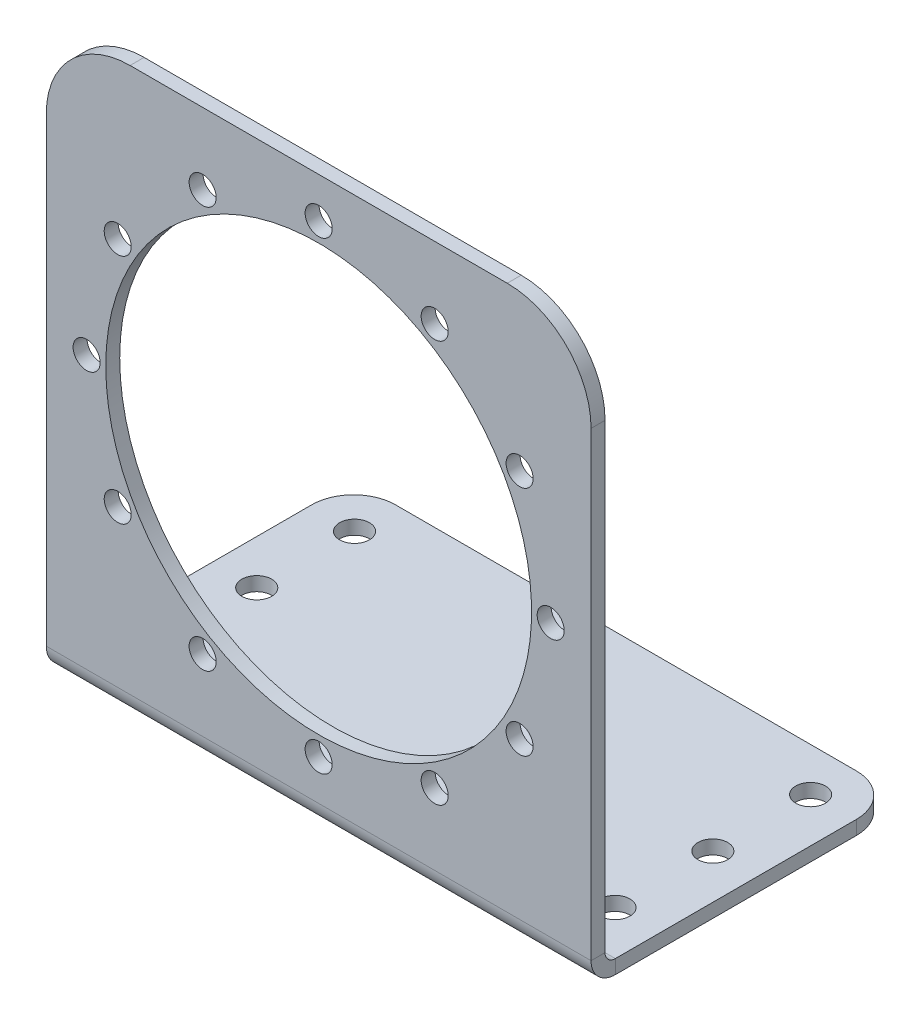
ISO-10303-21;
HEADER;
FILE_DESCRIPTION(('STEP AP214'),'2;1');
FILE_NAME('part.step','',(''),(''),'','','');
FILE_SCHEMA(('AUTOMOTIVE_DESIGN { 1 0 10303 214 1 1 1 1 }'));
ENDSEC;
DATA;
#1=APPLICATION_CONTEXT('core data for automotive mechanical design processes');
#2=APPLICATION_PROTOCOL_DEFINITION('international standard','automotive_design',2000,#1);
#3=PRODUCT_CONTEXT('',#1,'mechanical');
#4=PRODUCT('Part','Part','',(#3));
#5=PRODUCT_RELATED_PRODUCT_CATEGORY('part','',(#4));
#6=PRODUCT_DEFINITION_FORMATION('','',#4);
#7=PRODUCT_DEFINITION_CONTEXT('part definition',#1,'design');
#8=PRODUCT_DEFINITION('design','',#6,#7);
#9=PRODUCT_DEFINITION_SHAPE('','',#8);
#10=(LENGTH_UNIT() NAMED_UNIT(*) SI_UNIT(.MILLI.,.METRE.));
#11=(NAMED_UNIT(*) PLANE_ANGLE_UNIT() SI_UNIT($,.RADIAN.));
#12=(NAMED_UNIT(*) SI_UNIT($,.STERADIAN.) SOLID_ANGLE_UNIT());
#13=UNCERTAINTY_MEASURE_WITH_UNIT(LENGTH_MEASURE(1.E-05),#10,'distance_accuracy_value','');
#14=(GEOMETRIC_REPRESENTATION_CONTEXT(3) GLOBAL_UNCERTAINTY_ASSIGNED_CONTEXT((#13)) GLOBAL_UNIT_ASSIGNED_CONTEXT((#10,
#11,#12)) REPRESENTATION_CONTEXT('',''));
#15=CARTESIAN_POINT('',(0.,0.,0.));
#16=DIRECTION('',(0.,0.,1.));
#17=DIRECTION('',(1.,0.,0.));
#18=AXIS2_PLACEMENT_3D('',#15,#16,#17);
#19=CARTESIAN_POINT('',(0.,0.,-1.));
#20=DIRECTION('',(-1.,0.,0.));
#21=DIRECTION('',(0.,0.,1.));
#22=AXIS2_PLACEMENT_3D('',#19,#20,#21);
#23=PLANE('',#22);
#24=DIRECTION('',(0.,-1.,0.));
#25=VECTOR('',#24,1.);
#26=CARTESIAN_POINT('',(0.,0.,0.));
#27=LINE('',#26,#25);
#28=CARTESIAN_POINT('',(0.,33.,0.));
#29=VERTEX_POINT('',#28);
#30=CARTESIAN_POINT('',(0.,0.,0.));
#31=VERTEX_POINT('',#30);
#32=EDGE_CURVE('E197',#29,#31,#27,.T.);
#33=ORIENTED_EDGE('',*,*,#32,.F.);
#34=DIRECTION('',(0.,0.,1.));
#35=VECTOR('',#34,1.);
#36=CARTESIAN_POINT('',(0.,33.,-1.));
#37=LINE('',#36,#35);
#38=CARTESIAN_POINT('',(0.,33.,-1.));
#39=VERTEX_POINT('',#38);
#40=EDGE_CURVE('E235',#39,#29,#37,.T.);
#41=ORIENTED_EDGE('',*,*,#40,.F.);
#42=DIRECTION('',(0.,-1.,0.));
#43=VECTOR('',#42,1.);
#44=CARTESIAN_POINT('',(0.,0.,-1.));
#45=LINE('',#44,#43);
#46=CARTESIAN_POINT('',(0.,0.,-0.999999999999999));
#47=VERTEX_POINT('',#46);
#48=EDGE_CURVE('E202',#39,#47,#45,.T.);
#49=ORIENTED_EDGE('',*,*,#48,.T.);
#50=DIRECTION('',(0.,0.,1.));
#51=VECTOR('',#50,1.);
#52=CARTESIAN_POINT('',(0.,0.,-1.));
#53=LINE('',#52,#51);
#54=EDGE_CURVE('E220',#47,#31,#53,.T.);
#55=ORIENTED_EDGE('',*,*,#54,.T.);
#56=EDGE_LOOP('',(#33,#41,#49,#55));
#57=FACE_BOUND('',#56,.T.);
#58=ADVANCED_FACE('F60',(#57),#23,.T.);
#59=CARTESIAN_POINT('',(6.,33.,-1.));
#60=DIRECTION('',(0.,0.,1.));
#61=DIRECTION('',(1.,0.,0.));
#62=AXIS2_PLACEMENT_3D('',#59,#60,#61);
#63=CYLINDRICAL_SURFACE('',#62,6.);
#64=CARTESIAN_POINT('',(6.,33.,0.));
#65=DIRECTION('',(0.,0.,1.));
#66=DIRECTION('',(1.,0.,0.));
#67=AXIS2_PLACEMENT_3D('',#64,#65,#66);
#68=CIRCLE('',#67,6.);
#69=CARTESIAN_POINT('',(6.00000000000004,39.,0.));
#70=VERTEX_POINT('',#69);
#71=EDGE_CURVE('E206',#70,#29,#68,.T.);
#72=ORIENTED_EDGE('',*,*,#71,.F.);
#73=DIRECTION('',(0.,0.,1.));
#74=VECTOR('',#73,1.);
#75=CARTESIAN_POINT('',(6.00000000000004,39.,-1.));
#76=LINE('',#75,#74);
#77=CARTESIAN_POINT('',(6.00000000000004,39.,-1.));
#78=VERTEX_POINT('',#77);
#79=EDGE_CURVE('E238',#78,#70,#76,.T.);
#80=ORIENTED_EDGE('',*,*,#79,.F.);
#81=CARTESIAN_POINT('',(6.,33.,-1.));
#82=DIRECTION('',(0.,0.,1.));
#83=DIRECTION('',(1.,0.,0.));
#84=AXIS2_PLACEMENT_3D('',#81,#82,#83);
#85=CIRCLE('',#84,6.);
#86=EDGE_CURVE('E217',#78,#39,#85,.T.);
#87=ORIENTED_EDGE('',*,*,#86,.T.);
#88=ORIENTED_EDGE('',*,*,#40,.T.);
#89=EDGE_LOOP('',(#72,#80,#87,#88));
#90=FACE_BOUND('',#89,.T.);
#91=ADVANCED_FACE('F301',(#90),#63,.T.);
#92=CARTESIAN_POINT('',(6.00000000000004,39.,-1.));
#93=DIRECTION('',(0.,1.,0.));
#94=DIRECTION('',(0.,0.,1.));
#95=AXIS2_PLACEMENT_3D('',#92,#93,#94);
#96=PLANE('',#95);
#97=DIRECTION('',(-1.,0.,0.));
#98=VECTOR('',#97,1.);
#99=CARTESIAN_POINT('',(6.00000000000004,39.,0.));
#100=LINE('',#99,#98);
#101=CARTESIAN_POINT('',(33.,39.,0.));
#102=VERTEX_POINT('',#101);
#103=EDGE_CURVE('E230',#102,#70,#100,.T.);
#104=ORIENTED_EDGE('',*,*,#103,.F.);
#105=DIRECTION('',(0.,0.,1.));
#106=VECTOR('',#105,1.);
#107=CARTESIAN_POINT('',(33.,39.,-1.));
#108=LINE('',#107,#106);
#109=CARTESIAN_POINT('',(33.,39.,-1.));
#110=VERTEX_POINT('',#109);
#111=EDGE_CURVE('E240',#110,#102,#108,.T.);
#112=ORIENTED_EDGE('',*,*,#111,.F.);
#113=DIRECTION('',(-1.,0.,0.));
#114=VECTOR('',#113,1.);
#115=CARTESIAN_POINT('',(6.00000000000004,39.,-1.));
#116=LINE('',#115,#114);
#117=EDGE_CURVE('E214',#110,#78,#116,.T.);
#118=ORIENTED_EDGE('',*,*,#117,.T.);
#119=ORIENTED_EDGE('',*,*,#79,.T.);
#120=EDGE_LOOP('',(#104,#112,#118,#119));
#121=FACE_BOUND('',#120,.T.);
#122=ADVANCED_FACE('F303',(#121),#96,.T.);
#123=CARTESIAN_POINT('',(33.,33.,-1.));
#124=DIRECTION('',(0.,0.,1.));
#125=DIRECTION('',(1.,0.,0.));
#126=AXIS2_PLACEMENT_3D('',#123,#124,#125);
#127=CYLINDRICAL_SURFACE('',#126,6.);
#128=CARTESIAN_POINT('',(33.,33.,0.));
#129=DIRECTION('',(0.,0.,1.));
#130=DIRECTION('',(1.,0.,0.));
#131=AXIS2_PLACEMENT_3D('',#128,#129,#130);
#132=CIRCLE('',#131,6.);
#133=CARTESIAN_POINT('',(39.,33.,0.));
#134=VERTEX_POINT('',#133);
#135=EDGE_CURVE('E227',#134,#102,#132,.T.);
#136=ORIENTED_EDGE('',*,*,#135,.F.);
#137=DIRECTION('',(0.,0.,1.));
#138=VECTOR('',#137,1.);
#139=CARTESIAN_POINT('',(39.,33.,-1.));
#140=LINE('',#139,#138);
#141=CARTESIAN_POINT('',(39.,33.,-1.));
#142=VERTEX_POINT('',#141);
#143=EDGE_CURVE('E242',#142,#134,#140,.T.);
#144=ORIENTED_EDGE('',*,*,#143,.F.);
#145=CARTESIAN_POINT('',(33.,33.,-1.));
#146=DIRECTION('',(0.,0.,1.));
#147=DIRECTION('',(1.,0.,0.));
#148=AXIS2_PLACEMENT_3D('',#145,#146,#147);
#149=CIRCLE('',#148,6.);
#150=EDGE_CURVE('E211',#142,#110,#149,.T.);
#151=ORIENTED_EDGE('',*,*,#150,.T.);
#152=ORIENTED_EDGE('',*,*,#111,.T.);
#153=EDGE_LOOP('',(#136,#144,#151,#152));
#154=FACE_BOUND('',#153,.T.);
#155=ADVANCED_FACE('F293',(#154),#127,.T.);
#156=CARTESIAN_POINT('',(39.,0.,-1.));
#157=DIRECTION('',(1.,0.,0.));
#158=DIRECTION('',(0.,0.,-1.));
#159=AXIS2_PLACEMENT_3D('',#156,#157,#158);
#160=PLANE('',#159);
#161=DIRECTION('',(0.,1.,0.));
#162=VECTOR('',#161,1.);
#163=CARTESIAN_POINT('',(39.,0.,0.));
#164=LINE('',#163,#162);
#165=CARTESIAN_POINT('',(39.,0.,0.));
#166=VERTEX_POINT('',#165);
#167=EDGE_CURVE('E224',#166,#134,#164,.T.);
#168=ORIENTED_EDGE('',*,*,#167,.F.);
#169=DIRECTION('',(0.,0.,1.));
#170=VECTOR('',#169,1.);
#171=CARTESIAN_POINT('',(39.,0.,-1.));
#172=LINE('',#171,#170);
#173=CARTESIAN_POINT('',(39.,0.,-0.999999999999999));
#174=VERTEX_POINT('',#173);
#175=EDGE_CURVE('E244',#174,#166,#172,.T.);
#176=ORIENTED_EDGE('',*,*,#175,.F.);
#177=DIRECTION('',(0.,1.,0.));
#178=VECTOR('',#177,1.);
#179=CARTESIAN_POINT('',(39.,0.,-1.));
#180=LINE('',#179,#178);
#181=EDGE_CURVE('E208',#174,#142,#180,.T.);
#182=ORIENTED_EDGE('',*,*,#181,.T.);
#183=ORIENTED_EDGE('',*,*,#143,.T.);
#184=EDGE_LOOP('',(#168,#176,#182,#183));
#185=FACE_BOUND('',#184,.T.);
#186=ADVANCED_FACE('F284',(#185),#160,.T.);
#187=CARTESIAN_POINT('',(6.,33.,-1.));
#188=DIRECTION('',(0.,0.,1.));
#189=DIRECTION('',(1.,0.,0.));
#190=AXIS2_PLACEMENT_3D('',#187,#188,#189);
#191=PLANE('',#190);
#192=CARTESIAN_POINT('',(11.1947855554262,33.8850533857574,-1.));
#193=DIRECTION('',(0.,0.,-1.));
#194=DIRECTION('',(-1.,0.,0.));
#195=AXIS2_PLACEMENT_3D('',#192,#193,#194);
#196=CIRCLE('',#195,0.968487672521125);
#197=CARTESIAN_POINT('',(10.226297882905,33.8850533857574,-1.));
#198=VERTEX_POINT('',#197);
#199=EDGE_CURVE('E448',#198,#198,#196,.T.);
#200=ORIENTED_EDGE('',*,*,#199,.F.);
#201=EDGE_LOOP('',(#200));
#202=FACE_BOUND('',#201,.T.);
#203=CARTESIAN_POINT('',(5.11494661424296,27.8052144445739,-1.));
#204=DIRECTION('',(0.,0.,-1.));
#205=DIRECTION('',(-1.,0.,0.));
#206=AXIS2_PLACEMENT_3D('',#203,#204,#205);
#207=CIRCLE('',#206,0.968487672520813);
#208=CARTESIAN_POINT('',(4.14645894172215,27.8052144445739,-1.));
#209=VERTEX_POINT('',#208);
#210=EDGE_CURVE('E444',#209,#209,#207,.T.);
#211=ORIENTED_EDGE('',*,*,#210,.F.);
#212=EDGE_LOOP('',(#211));
#213=FACE_BOUND('',#212,.T.);
#214=CARTESIAN_POINT('',(2.88957111085208,19.5,-1.));
#215=DIRECTION('',(0.,0.,-1.));
#216=DIRECTION('',(-1.,0.,0.));
#217=AXIS2_PLACEMENT_3D('',#214,#215,#216);
#218=CIRCLE('',#217,0.968487672520642);
#219=CARTESIAN_POINT('',(1.92108343833144,19.5,-1.));
#220=VERTEX_POINT('',#219);
#221=EDGE_CURVE('E440',#220,#220,#218,.T.);
#222=ORIENTED_EDGE('',*,*,#221,.F.);
#223=EDGE_LOOP('',(#222));
#224=FACE_BOUND('',#223,.T.);
#225=CARTESIAN_POINT('',(5.11494661424299,11.194785555426,-1.));
#226=DIRECTION('',(0.,0.,-1.));
#227=DIRECTION('',(-1.,0.,0.));
#228=AXIS2_PLACEMENT_3D('',#225,#226,#227);
#229=CIRCLE('',#228,0.968487672520409);
#230=CARTESIAN_POINT('',(4.14645894172258,11.194785555426,-1.));
#231=VERTEX_POINT('',#230);
#232=EDGE_CURVE('E436',#231,#231,#229,.T.);
#233=ORIENTED_EDGE('',*,*,#232,.F.);
#234=EDGE_LOOP('',(#233));
#235=FACE_BOUND('',#234,.T.);
#236=CARTESIAN_POINT('',(11.1947855554261,5.11494661424296,-1.));
#237=DIRECTION('',(0.,0.,-1.));
#238=DIRECTION('',(-1.,0.,0.));
#239=AXIS2_PLACEMENT_3D('',#236,#237,#238);
#240=CIRCLE('',#239,0.968487672520217);
#241=CARTESIAN_POINT('',(10.2262978829058,5.11494661424296,-1.));
#242=VERTEX_POINT('',#241);
#243=EDGE_CURVE('E432',#242,#242,#240,.T.);
#244=ORIENTED_EDGE('',*,*,#243,.F.);
#245=EDGE_LOOP('',(#244));
#246=FACE_BOUND('',#245,.T.);
#247=CARTESIAN_POINT('',(19.5,2.88957111085208,-1.));
#248=DIRECTION('',(0.,0.,-1.));
#249=DIRECTION('',(-1.,0.,0.));
#250=AXIS2_PLACEMENT_3D('',#247,#248,#249);
#251=CIRCLE('',#250,0.968487672520107);
#252=CARTESIAN_POINT('',(18.5315123274799,2.88957111085208,-1.));
#253=VERTEX_POINT('',#252);
#254=EDGE_CURVE('E428',#253,#253,#251,.T.);
#255=ORIENTED_EDGE('',*,*,#254,.F.);
#256=EDGE_LOOP('',(#255));
#257=FACE_BOUND('',#256,.T.);
#258=CARTESIAN_POINT('',(27.805214444574,5.11494661424297,-1.));
#259=DIRECTION('',(0.,0.,-1.));
#260=DIRECTION('',(-1.,0.,0.));
#261=AXIS2_PLACEMENT_3D('',#258,#259,#260);
#262=CIRCLE('',#261,0.968487672520122);
#263=CARTESIAN_POINT('',(26.8367267720538,5.11494661424297,-1.));
#264=VERTEX_POINT('',#263);
#265=EDGE_CURVE('E424',#264,#264,#262,.T.);
#266=ORIENTED_EDGE('',*,*,#265,.F.);
#267=EDGE_LOOP('',(#266));
#268=FACE_BOUND('',#267,.T.);
#269=CARTESIAN_POINT('',(33.885053385757,11.194785555426,-1.));
#270=DIRECTION('',(0.,0.,-1.));
#271=DIRECTION('',(-1.,0.,0.));
#272=AXIS2_PLACEMENT_3D('',#269,#270,#271);
#273=CIRCLE('',#272,0.968487672520261);
#274=CARTESIAN_POINT('',(32.9165657132368,11.194785555426,-1.));
#275=VERTEX_POINT('',#274);
#276=EDGE_CURVE('E420',#275,#275,#273,.T.);
#277=ORIENTED_EDGE('',*,*,#276,.F.);
#278=EDGE_LOOP('',(#277));
#279=FACE_BOUND('',#278,.T.);
#280=CARTESIAN_POINT('',(36.1104288891479,19.5,-1.));
#281=DIRECTION('',(0.,0.,-1.));
#282=DIRECTION('',(-1.,0.,0.));
#283=AXIS2_PLACEMENT_3D('',#280,#281,#282);
#284=CIRCLE('',#283,0.968487672520483);
#285=CARTESIAN_POINT('',(35.1419412166274,19.5,-1.));
#286=VERTEX_POINT('',#285);
#287=EDGE_CURVE('E416',#286,#286,#284,.T.);
#288=ORIENTED_EDGE('',*,*,#287,.F.);
#289=EDGE_LOOP('',(#288));
#290=FACE_BOUND('',#289,.T.);
#291=CARTESIAN_POINT('',(33.885053385757,27.805214444574,-1.));
#292=DIRECTION('',(0.,0.,-1.));
#293=DIRECTION('',(-1.,0.,0.));
#294=AXIS2_PLACEMENT_3D('',#291,#292,#293);
#295=CIRCLE('',#294,0.968487672520739);
#296=CARTESIAN_POINT('',(32.9165657132363,27.805214444574,-1.));
#297=VERTEX_POINT('',#296);
#298=EDGE_CURVE('E412',#297,#297,#295,.T.);
#299=ORIENTED_EDGE('',*,*,#298,.F.);
#300=EDGE_LOOP('',(#299));
#301=FACE_BOUND('',#300,.T.);
#302=CARTESIAN_POINT('',(27.8052144445739,33.8850533857568,-1.));
#303=DIRECTION('',(0.,0.,-1.));
#304=DIRECTION('',(-1.,0.,0.));
#305=AXIS2_PLACEMENT_3D('',#302,#303,#304);
#306=CIRCLE('',#305,0.968487672521131);
#307=CARTESIAN_POINT('',(26.8367267720528,33.8850533857568,-1.));
#308=VERTEX_POINT('',#307);
#309=EDGE_CURVE('E408',#308,#308,#306,.T.);
#310=ORIENTED_EDGE('',*,*,#309,.F.);
#311=EDGE_LOOP('',(#310));
#312=FACE_BOUND('',#311,.T.);
#313=CARTESIAN_POINT('',(19.5,36.1104288891479,-1.));
#314=DIRECTION('',(0.,0.,-1.));
#315=DIRECTION('',(-1.,0.,0.));
#316=AXIS2_PLACEMENT_3D('',#313,#314,#315);
#317=CIRCLE('',#316,0.968487672521123);
#318=CARTESIAN_POINT('',(18.5315123274789,36.1104288891479,-1.));
#319=VERTEX_POINT('',#318);
#320=EDGE_CURVE('E404',#319,#319,#317,.T.);
#321=ORIENTED_EDGE('',*,*,#320,.F.);
#322=EDGE_LOOP('',(#321));
#323=FACE_BOUND('',#322,.T.);
#324=CARTESIAN_POINT('',(19.5,19.5,-1.));
#325=DIRECTION('',(0.,0.,-1.));
#326=DIRECTION('',(-1.,0.,0.));
#327=AXIS2_PLACEMENT_3D('',#324,#325,#326);
#328=CIRCLE('',#327,15.2419559251988);
#329=CARTESIAN_POINT('',(4.25804407480123,19.5,-1.));
#330=VERTEX_POINT('',#329);
#331=EDGE_CURVE('E399',#330,#330,#328,.T.);
#332=ORIENTED_EDGE('',*,*,#331,.F.);
#333=EDGE_LOOP('',(#332));
#334=FACE_BOUND('',#333,.T.);
#335=ORIENTED_EDGE('',*,*,#48,.F.);
#336=ORIENTED_EDGE('',*,*,#86,.F.);
#337=ORIENTED_EDGE('',*,*,#117,.F.);
#338=ORIENTED_EDGE('',*,*,#150,.F.);
#339=ORIENTED_EDGE('',*,*,#181,.F.);
#340=DIRECTION('',(1.,0.,0.));
#341=VECTOR('',#340,1.);
#342=CARTESIAN_POINT('',(0.,0.,-1.));
#343=LINE('',#342,#341);
#344=EDGE_CURVE('E205',#47,#174,#343,.T.);
#345=ORIENTED_EDGE('',*,*,#344,.F.);
#346=EDGE_LOOP('',(#335,#336,#337,#338,#339,#345));
#347=FACE_BOUND('',#346,.T.);
#348=ADVANCED_FACE('F288',(#202,#213,#224,#235,#246,#257,#268,#279,#290,#301,#312,#323,#334,
#347),#191,.F.);
#349=CARTESIAN_POINT('',(6.,33.,0.));
#350=DIRECTION('',(0.,0.,1.));
#351=DIRECTION('',(1.,0.,0.));
#352=AXIS2_PLACEMENT_3D('',#349,#350,#351);
#353=PLANE('',#352);
#354=CARTESIAN_POINT('',(11.1947855554262,33.8850533857574,0.));
#355=DIRECTION('',(0.,0.,-1.));
#356=DIRECTION('',(-1.,0.,0.));
#357=AXIS2_PLACEMENT_3D('',#354,#355,#356);
#358=CIRCLE('',#357,0.968487672521125);
#359=CARTESIAN_POINT('',(10.226297882905,33.8850533857574,0.));
#360=VERTEX_POINT('',#359);
#361=EDGE_CURVE('E351',#360,#360,#358,.T.);
#362=ORIENTED_EDGE('',*,*,#361,.T.);
#363=EDGE_LOOP('',(#362));
#364=FACE_BOUND('',#363,.T.);
#365=CARTESIAN_POINT('',(5.11494661424296,27.8052144445739,0.));
#366=DIRECTION('',(0.,0.,-1.));
#367=DIRECTION('',(-1.,0.,0.));
#368=AXIS2_PLACEMENT_3D('',#365,#366,#367);
#369=CIRCLE('',#368,0.968487672520813);
#370=CARTESIAN_POINT('',(4.14645894172215,27.8052144445739,0.));
#371=VERTEX_POINT('',#370);
#372=EDGE_CURVE('E355',#371,#371,#369,.T.);
#373=ORIENTED_EDGE('',*,*,#372,.T.);
#374=EDGE_LOOP('',(#373));
#375=FACE_BOUND('',#374,.T.);
#376=CARTESIAN_POINT('',(2.88957111085208,19.5,0.));
#377=DIRECTION('',(0.,0.,-1.));
#378=DIRECTION('',(-1.,0.,0.));
#379=AXIS2_PLACEMENT_3D('',#376,#377,#378);
#380=CIRCLE('',#379,0.968487672520642);
#381=CARTESIAN_POINT('',(1.92108343833144,19.5,0.));
#382=VERTEX_POINT('',#381);
#383=EDGE_CURVE('E359',#382,#382,#380,.T.);
#384=ORIENTED_EDGE('',*,*,#383,.T.);
#385=EDGE_LOOP('',(#384));
#386=FACE_BOUND('',#385,.T.);
#387=CARTESIAN_POINT('',(5.11494661424299,11.194785555426,0.));
#388=DIRECTION('',(0.,0.,-1.));
#389=DIRECTION('',(-1.,0.,0.));
#390=AXIS2_PLACEMENT_3D('',#387,#388,#389);
#391=CIRCLE('',#390,0.968487672520409);
#392=CARTESIAN_POINT('',(4.14645894172258,11.194785555426,0.));
#393=VERTEX_POINT('',#392);
#394=EDGE_CURVE('E363',#393,#393,#391,.T.);
#395=ORIENTED_EDGE('',*,*,#394,.T.);
#396=EDGE_LOOP('',(#395));
#397=FACE_BOUND('',#396,.T.);
#398=CARTESIAN_POINT('',(11.1947855554261,5.11494661424296,0.));
#399=DIRECTION('',(0.,0.,-1.));
#400=DIRECTION('',(-1.,0.,0.));
#401=AXIS2_PLACEMENT_3D('',#398,#399,#400);
#402=CIRCLE('',#401,0.968487672520217);
#403=CARTESIAN_POINT('',(10.2262978829058,5.11494661424296,0.));
#404=VERTEX_POINT('',#403);
#405=EDGE_CURVE('E367',#404,#404,#402,.T.);
#406=ORIENTED_EDGE('',*,*,#405,.T.);
#407=EDGE_LOOP('',(#406));
#408=FACE_BOUND('',#407,.T.);
#409=CARTESIAN_POINT('',(19.5,2.88957111085208,0.));
#410=DIRECTION('',(0.,0.,-1.));
#411=DIRECTION('',(-1.,0.,0.));
#412=AXIS2_PLACEMENT_3D('',#409,#410,#411);
#413=CIRCLE('',#412,0.968487672520107);
#414=CARTESIAN_POINT('',(18.5315123274799,2.88957111085208,0.));
#415=VERTEX_POINT('',#414);
#416=EDGE_CURVE('E371',#415,#415,#413,.T.);
#417=ORIENTED_EDGE('',*,*,#416,.T.);
#418=EDGE_LOOP('',(#417));
#419=FACE_BOUND('',#418,.T.);
#420=CARTESIAN_POINT('',(27.805214444574,5.11494661424297,0.));
#421=DIRECTION('',(0.,0.,-1.));
#422=DIRECTION('',(-1.,0.,0.));
#423=AXIS2_PLACEMENT_3D('',#420,#421,#422);
#424=CIRCLE('',#423,0.968487672520122);
#425=CARTESIAN_POINT('',(26.8367267720538,5.11494661424297,0.));
#426=VERTEX_POINT('',#425);
#427=EDGE_CURVE('E375',#426,#426,#424,.T.);
#428=ORIENTED_EDGE('',*,*,#427,.T.);
#429=EDGE_LOOP('',(#428));
#430=FACE_BOUND('',#429,.T.);
#431=CARTESIAN_POINT('',(33.885053385757,11.194785555426,0.));
#432=DIRECTION('',(0.,0.,-1.));
#433=DIRECTION('',(-1.,0.,0.));
#434=AXIS2_PLACEMENT_3D('',#431,#432,#433);
#435=CIRCLE('',#434,0.968487672520261);
#436=CARTESIAN_POINT('',(32.9165657132368,11.194785555426,0.));
#437=VERTEX_POINT('',#436);
#438=EDGE_CURVE('E379',#437,#437,#435,.T.);
#439=ORIENTED_EDGE('',*,*,#438,.T.);
#440=EDGE_LOOP('',(#439));
#441=FACE_BOUND('',#440,.T.);
#442=CARTESIAN_POINT('',(36.1104288891479,19.5,0.));
#443=DIRECTION('',(0.,0.,-1.));
#444=DIRECTION('',(-1.,0.,0.));
#445=AXIS2_PLACEMENT_3D('',#442,#443,#444);
#446=CIRCLE('',#445,0.968487672520483);
#447=CARTESIAN_POINT('',(35.1419412166274,19.5,0.));
#448=VERTEX_POINT('',#447);
#449=EDGE_CURVE('E383',#448,#448,#446,.T.);
#450=ORIENTED_EDGE('',*,*,#449,.T.);
#451=EDGE_LOOP('',(#450));
#452=FACE_BOUND('',#451,.T.);
#453=CARTESIAN_POINT('',(33.885053385757,27.805214444574,0.));
#454=DIRECTION('',(0.,0.,-1.));
#455=DIRECTION('',(-1.,0.,0.));
#456=AXIS2_PLACEMENT_3D('',#453,#454,#455);
#457=CIRCLE('',#456,0.968487672520739);
#458=CARTESIAN_POINT('',(32.9165657132363,27.805214444574,0.));
#459=VERTEX_POINT('',#458);
#460=EDGE_CURVE('E387',#459,#459,#457,.T.);
#461=ORIENTED_EDGE('',*,*,#460,.T.);
#462=EDGE_LOOP('',(#461));
#463=FACE_BOUND('',#462,.T.);
#464=CARTESIAN_POINT('',(27.8052144445739,33.8850533857568,0.));
#465=DIRECTION('',(0.,0.,-1.));
#466=DIRECTION('',(-1.,0.,0.));
#467=AXIS2_PLACEMENT_3D('',#464,#465,#466);
#468=CIRCLE('',#467,0.968487672521131);
#469=CARTESIAN_POINT('',(26.8367267720528,33.8850533857568,0.));
#470=VERTEX_POINT('',#469);
#471=EDGE_CURVE('E391',#470,#470,#468,.T.);
#472=ORIENTED_EDGE('',*,*,#471,.T.);
#473=EDGE_LOOP('',(#472));
#474=FACE_BOUND('',#473,.T.);
#475=CARTESIAN_POINT('',(19.5,36.1104288891479,0.));
#476=DIRECTION('',(0.,0.,-1.));
#477=DIRECTION('',(-1.,0.,0.));
#478=AXIS2_PLACEMENT_3D('',#475,#476,#477);
#479=CIRCLE('',#478,0.968487672521123);
#480=CARTESIAN_POINT('',(18.5315123274789,36.1104288891479,0.));
#481=VERTEX_POINT('',#480);
#482=EDGE_CURVE('E395',#481,#481,#479,.T.);
#483=ORIENTED_EDGE('',*,*,#482,.T.);
#484=EDGE_LOOP('',(#483));
#485=FACE_BOUND('',#484,.T.);
#486=CARTESIAN_POINT('',(19.5,19.5,0.));
#487=DIRECTION('',(0.,0.,-1.));
#488=DIRECTION('',(-1.,0.,0.));
#489=AXIS2_PLACEMENT_3D('',#486,#487,#488);
#490=CIRCLE('',#489,15.2419559251988);
#491=CARTESIAN_POINT('',(4.25804407480123,19.5,0.));
#492=VERTEX_POINT('',#491);
#493=EDGE_CURVE('E196',#492,#492,#490,.T.);
#494=ORIENTED_EDGE('',*,*,#493,.T.);
#495=EDGE_LOOP('',(#494));
#496=FACE_BOUND('',#495,.T.);
#497=ORIENTED_EDGE('',*,*,#32,.T.);
#498=DIRECTION('',(1.,0.,0.));
#499=VECTOR('',#498,1.);
#500=CARTESIAN_POINT('',(0.,0.,0.));
#501=LINE('',#500,#499);
#502=EDGE_CURVE('E158',#31,#166,#501,.T.);
#503=ORIENTED_EDGE('',*,*,#502,.T.);
#504=ORIENTED_EDGE('',*,*,#167,.T.);
#505=ORIENTED_EDGE('',*,*,#135,.T.);
#506=ORIENTED_EDGE('',*,*,#103,.T.);
#507=ORIENTED_EDGE('',*,*,#71,.T.);
#508=EDGE_LOOP('',(#497,#503,#504,#505,#506,#507));
#509=FACE_BOUND('',#508,.T.);
#510=ADVANCED_FACE('F296',(#364,#375,#386,#397,#408,#419,#430,#441,#452,#463,#474,#485,#496,
#509),#353,.T.);
#511=CARTESIAN_POINT('',(39.,0.,-1.7366));
#512=DIRECTION('',(1.,0.,0.));
#513=DIRECTION('',(0.,1.,0.));
#514=AXIS2_PLACEMENT_3D('',#511,#512,#513);
#515=PLANE('',#514);
#516=DIRECTION('',(0.,1.,0.));
#517=VECTOR('',#516,1.);
#518=CARTESIAN_POINT('',(39.,-1.7366,-1.73659999999999));
#519=LINE('',#518,#517);
#520=CARTESIAN_POINT('',(39.,-0.7366,-1.7366));
#521=VERTEX_POINT('',#520);
#522=CARTESIAN_POINT('',(39.,-1.7366,-1.73659999999999));
#523=VERTEX_POINT('',#522);
#524=EDGE_CURVE('E193',#521,#523,#519,.F.);
#525=ORIENTED_EDGE('',*,*,#524,.F.);
#526=CARTESIAN_POINT('',(39.,0.,-1.7366));
#527=DIRECTION('',(-1.,0.,0.));
#528=DIRECTION('',(0.,-1.,0.));
#529=AXIS2_PLACEMENT_3D('',#526,#527,#528);
#530=CIRCLE('',#529,0.736600000000001);
#531=EDGE_CURVE('E162',#174,#521,#530,.F.);
#532=ORIENTED_EDGE('',*,*,#531,.F.);
#533=ORIENTED_EDGE('',*,*,#175,.T.);
#534=CARTESIAN_POINT('',(39.,0.,-1.7366));
#535=DIRECTION('',(-1.,0.,0.));
#536=DIRECTION('',(0.,-1.,0.));
#537=AXIS2_PLACEMENT_3D('',#534,#535,#536);
#538=CIRCLE('',#537,1.7366);
#539=EDGE_CURVE('E161',#166,#523,#538,.F.);
#540=ORIENTED_EDGE('',*,*,#539,.T.);
#541=EDGE_LOOP('',(#525,#532,#533,#540));
#542=FACE_BOUND('',#541,.T.);
#543=ADVANCED_FACE('F280',(#542),#515,.T.);
#544=CARTESIAN_POINT('',(0.,0.,-1.7366));
#545=DIRECTION('',(1.,0.,0.));
#546=DIRECTION('',(0.,1.,0.));
#547=AXIS2_PLACEMENT_3D('',#544,#545,#546);
#548=PLANE('',#547);
#549=CARTESIAN_POINT('',(0.,0.,-1.7366));
#550=DIRECTION('',(-1.,0.,0.));
#551=DIRECTION('',(0.,-1.,0.));
#552=AXIS2_PLACEMENT_3D('',#549,#550,#551);
#553=CIRCLE('',#552,0.736600000000001);
#554=CARTESIAN_POINT('',(0.,-0.736600000000003,-1.7366));
#555=VERTEX_POINT('',#554);
#556=EDGE_CURVE('E169',#555,#47,#553,.T.);
#557=ORIENTED_EDGE('',*,*,#556,.F.);
#558=DIRECTION('',(0.,1.,0.));
#559=VECTOR('',#558,1.);
#560=CARTESIAN_POINT('',(0.,-0.7366,-1.7366));
#561=LINE('',#560,#559);
#562=CARTESIAN_POINT('',(0.,-1.7366,-1.73659999999999));
#563=VERTEX_POINT('',#562);
#564=EDGE_CURVE('E166',#555,#563,#561,.F.);
#565=ORIENTED_EDGE('',*,*,#564,.T.);
#566=CARTESIAN_POINT('',(0.,0.,-1.7366));
#567=DIRECTION('',(-1.,0.,0.));
#568=DIRECTION('',(0.,-1.,0.));
#569=AXIS2_PLACEMENT_3D('',#566,#567,#568);
#570=CIRCLE('',#569,1.7366);
#571=EDGE_CURVE('E151',#563,#31,#570,.T.);
#572=ORIENTED_EDGE('',*,*,#571,.T.);
#573=ORIENTED_EDGE('',*,*,#54,.F.);
#574=EDGE_LOOP('',(#557,#565,#572,#573));
#575=FACE_BOUND('',#574,.T.);
#576=ADVANCED_FACE('F167',(#575),#548,.F.);
#577=CARTESIAN_POINT('',(0.,0.,-1.7366));
#578=DIRECTION('',(-1.,0.,0.));
#579=DIRECTION('',(0.,-1.,0.));
#580=AXIS2_PLACEMENT_3D('',#577,#578,#579);
#581=CYLINDRICAL_SURFACE('',#580,1.7366);
#582=ORIENTED_EDGE('',*,*,#502,.F.);
#583=ORIENTED_EDGE('',*,*,#571,.F.);
#584=DIRECTION('',(-1.,0.,0.));
#585=VECTOR('',#584,1.);
#586=CARTESIAN_POINT('',(39.,-1.7366,-1.73659999999999));
#587=LINE('',#586,#585);
#588=EDGE_CURVE('E155',#563,#523,#587,.F.);
#589=ORIENTED_EDGE('',*,*,#588,.T.);
#590=ORIENTED_EDGE('',*,*,#539,.F.);
#591=EDGE_LOOP('',(#582,#583,#589,#590));
#592=FACE_BOUND('',#591,.T.);
#593=ADVANCED_FACE('F153',(#592),#581,.T.);
#594=CARTESIAN_POINT('',(0.,0.,-1.7366));
#595=DIRECTION('',(-1.,0.,0.));
#596=DIRECTION('',(0.,-1.,0.));
#597=AXIS2_PLACEMENT_3D('',#594,#595,#596);
#598=CYLINDRICAL_SURFACE('',#597,0.736600000000001);
#599=ORIENTED_EDGE('',*,*,#344,.T.);
#600=ORIENTED_EDGE('',*,*,#531,.T.);
#601=DIRECTION('',(-1.,0.,0.));
#602=VECTOR('',#601,1.);
#603=CARTESIAN_POINT('',(39.,-0.7366,-1.7366));
#604=LINE('',#603,#602);
#605=EDGE_CURVE('E171',#521,#555,#604,.T.);
#606=ORIENTED_EDGE('',*,*,#605,.T.);
#607=ORIENTED_EDGE('',*,*,#556,.T.);
#608=EDGE_LOOP('',(#599,#600,#606,#607));
#609=FACE_BOUND('',#608,.T.);
#610=ADVANCED_FACE('F275',(#609),#598,.F.);
#611=CARTESIAN_POINT('',(0.,-1.73660000000007,-22.));
#612=DIRECTION('',(1.,0.,0.));
#613=DIRECTION('',(0.,0.,-1.));
#614=AXIS2_PLACEMENT_3D('',#611,#612,#613);
#615=PLANE('',#614);
#616=DIRECTION('',(0.,0.,1.));
#617=VECTOR('',#616,1.);
#618=CARTESIAN_POINT('',(0.,-0.736600000000071,-22.));
#619=LINE('',#618,#617);
#620=CARTESIAN_POINT('',(0.,-0.73660000000006,-19.));
#621=VERTEX_POINT('',#620);
#622=EDGE_CURVE('E179',#555,#621,#619,.F.);
#623=ORIENTED_EDGE('',*,*,#622,.T.);
#624=DIRECTION('',(0.,1.,0.));
#625=VECTOR('',#624,1.);
#626=CARTESIAN_POINT('',(0.,-1.73660000000006,-19.));
#627=LINE('',#626,#625);
#628=CARTESIAN_POINT('',(0.,-1.73660000000006,-19.));
#629=VERTEX_POINT('',#628);
#630=EDGE_CURVE('E13',#621,#629,#627,.F.);
#631=ORIENTED_EDGE('',*,*,#630,.T.);
#632=DIRECTION('',(0.,0.,-1.));
#633=VECTOR('',#632,1.);
#634=CARTESIAN_POINT('',(0.,-1.73659999999999,0.));
#635=LINE('',#634,#633);
#636=EDGE_CURVE('E175',#563,#629,#635,.T.);
#637=ORIENTED_EDGE('',*,*,#636,.F.);
#638=ORIENTED_EDGE('',*,*,#564,.F.);
#639=EDGE_LOOP('',(#623,#631,#637,#638));
#640=FACE_BOUND('',#639,.T.);
#641=ADVANCED_FACE('F181',(#640),#615,.F.);
#642=CARTESIAN_POINT('',(39.,-1.7366,-0.999999999999997));
#643=DIRECTION('',(-1.,0.,0.));
#644=DIRECTION('',(0.,0.,1.));
#645=AXIS2_PLACEMENT_3D('',#642,#643,#644);
#646=PLANE('',#645);
#647=DIRECTION('',(0.,0.,1.));
#648=VECTOR('',#647,1.);
#649=CARTESIAN_POINT('',(39.,-1.73659999999999,0.));
#650=LINE('',#649,#648);
#651=CARTESIAN_POINT('',(39.,-1.73660000000006,-19.));
#652=VERTEX_POINT('',#651);
#653=EDGE_CURVE('E178',#652,#523,#650,.T.);
#654=ORIENTED_EDGE('',*,*,#653,.F.);
#655=DIRECTION('',(0.,1.,0.));
#656=VECTOR('',#655,1.);
#657=CARTESIAN_POINT('',(39.,-1.73660000000006,-19.));
#658=LINE('',#657,#656);
#659=CARTESIAN_POINT('',(39.,-0.73660000000006,-19.));
#660=VERTEX_POINT('',#659);
#661=EDGE_CURVE('E237',#652,#660,#658,.T.);
#662=ORIENTED_EDGE('',*,*,#661,.T.);
#663=DIRECTION('',(0.,0.,-1.));
#664=VECTOR('',#663,1.);
#665=CARTESIAN_POINT('',(39.,-0.736599999999997,-1.));
#666=LINE('',#665,#664);
#667=EDGE_CURVE('E183',#660,#521,#666,.F.);
#668=ORIENTED_EDGE('',*,*,#667,.T.);
#669=ORIENTED_EDGE('',*,*,#524,.T.);
#670=EDGE_LOOP('',(#654,#662,#668,#669));
#671=FACE_BOUND('',#670,.T.);
#672=ADVANCED_FACE('F263',(#671),#646,.F.);
#673=CARTESIAN_POINT('',(0.,-1.73659999999999,0.));
#674=DIRECTION('',(0.,1.,0.));
#675=DIRECTION('',(0.,0.,1.));
#676=AXIS2_PLACEMENT_3D('',#673,#674,#675);
#677=PLANE('',#676);
#678=CARTESIAN_POINT('',(35.8245183934839,-1.73660000000006,-18.8915720295029));
#679=DIRECTION('',(0.,1.,0.));
#680=DIRECTION('',(0.,0.,-1.));
#681=AXIS2_PLACEMENT_3D('',#678,#679,#680);
#682=CIRCLE('',#681,1.06661142234424);
#683=CARTESIAN_POINT('',(35.8245183934839,-1.73660000000006,-19.9581834518471));
#684=VERTEX_POINT('',#683);
#685=EDGE_CURVE('E480',#684,#684,#682,.T.);
#686=ORIENTED_EDGE('',*,*,#685,.T.);
#687=EDGE_LOOP('',(#686));
#688=FACE_BOUND('',#687,.T.);
#689=CARTESIAN_POINT('',(35.8245183934838,-1.73660000000004,-11.8915720295029));
#690=DIRECTION('',(0.,1.,0.));
#691=DIRECTION('',(0.,0.,-1.));
#692=AXIS2_PLACEMENT_3D('',#689,#690,#691);
#693=CIRCLE('',#692,1.06661142234424);
#694=CARTESIAN_POINT('',(35.8245183934838,-1.73660000000004,-12.9581834518471));
#695=VERTEX_POINT('',#694);
#696=EDGE_CURVE('E474',#695,#695,#693,.T.);
#697=ORIENTED_EDGE('',*,*,#696,.T.);
#698=EDGE_LOOP('',(#697));
#699=FACE_BOUND('',#698,.T.);
#700=CARTESIAN_POINT('',(3.17548160651623,-1.73660000000001,-4.89157202950286));
#701=DIRECTION('',(0.,1.,0.));
#702=DIRECTION('',(0.,0.,1.));
#703=AXIS2_PLACEMENT_3D('',#700,#701,#702);
#704=CIRCLE('',#703,1.06661142234424);
#705=CARTESIAN_POINT('',(3.17548160651623,-1.73660000000001,-3.82496060715862));
#706=VERTEX_POINT('',#705);
#707=EDGE_CURVE('E468',#706,#706,#704,.T.);
#708=ORIENTED_EDGE('',*,*,#707,.T.);
#709=EDGE_LOOP('',(#708));
#710=FACE_BOUND('',#709,.T.);
#711=CARTESIAN_POINT('',(3.17548160651616,-1.73660000000004,-11.8915720295029));
#712=DIRECTION('',(0.,1.,0.));
#713=DIRECTION('',(0.,0.,1.));
#714=AXIS2_PLACEMENT_3D('',#711,#712,#713);
#715=CIRCLE('',#714,1.06661142234424);
#716=CARTESIAN_POINT('',(3.17548160651616,-1.73660000000003,-10.8249606071586));
#717=VERTEX_POINT('',#716);
#718=EDGE_CURVE('E462',#717,#717,#715,.T.);
#719=ORIENTED_EDGE('',*,*,#718,.T.);
#720=EDGE_LOOP('',(#719));
#721=FACE_BOUND('',#720,.T.);
#722=CARTESIAN_POINT('',(35.8245183934838,-1.73660000000001,-4.89157202950286));
#723=DIRECTION('',(0.,1.,0.));
#724=DIRECTION('',(0.,0.,-1.));
#725=AXIS2_PLACEMENT_3D('',#722,#723,#724);
#726=CIRCLE('',#725,1.06661142234424);
#727=CARTESIAN_POINT('',(35.8245183934838,-1.73660000000001,-5.9581834518471));
#728=VERTEX_POINT('',#727);
#729=EDGE_CURVE('E456',#728,#728,#726,.T.);
#730=ORIENTED_EDGE('',*,*,#729,.T.);
#731=EDGE_LOOP('',(#730));
#732=FACE_BOUND('',#731,.T.);
#733=CARTESIAN_POINT('',(3.17548160651609,-1.73660000000006,-18.8915720295029));
#734=DIRECTION('',(0.,1.,0.));
#735=DIRECTION('',(0.,0.,1.));
#736=AXIS2_PLACEMENT_3D('',#733,#734,#735);
#737=CIRCLE('',#736,1.06661142234424);
#738=CARTESIAN_POINT('',(3.17548160651609,-1.73660000000006,-17.8249606071586));
#739=VERTEX_POINT('',#738);
#740=EDGE_CURVE('E451',#739,#739,#737,.T.);
#741=ORIENTED_EDGE('',*,*,#740,.T.);
#742=EDGE_LOOP('',(#741));
#743=FACE_BOUND('',#742,.T.);
#744=DIRECTION('',(1.,0.,0.));
#745=VECTOR('',#744,1.);
#746=CARTESIAN_POINT('',(0.,-1.73660000000007,-22.));
#747=LINE('',#746,#745);
#748=CARTESIAN_POINT('',(3.,-1.73660000000007,-22.));
#749=VERTEX_POINT('',#748);
#750=CARTESIAN_POINT('',(36.,-1.73660000000007,-22.));
#751=VERTEX_POINT('',#750);
#752=EDGE_CURVE('E182',#749,#751,#747,.T.);
#753=ORIENTED_EDGE('',*,*,#752,.T.);
#754=CARTESIAN_POINT('',(36.,-1.73660000000006,-19.));
#755=DIRECTION('',(0.,1.,0.));
#756=DIRECTION('',(0.,0.,1.));
#757=AXIS2_PLACEMENT_3D('',#754,#755,#756);
#758=CIRCLE('',#757,3.);
#759=EDGE_CURVE('E68',#751,#652,#758,.F.);
#760=ORIENTED_EDGE('',*,*,#759,.T.);
#761=ORIENTED_EDGE('',*,*,#653,.T.);
#762=ORIENTED_EDGE('',*,*,#588,.F.);
#763=ORIENTED_EDGE('',*,*,#636,.T.);
#764=CARTESIAN_POINT('',(3.,-1.73660000000006,-19.));
#765=DIRECTION('',(0.,1.,0.));
#766=DIRECTION('',(0.,0.,1.));
#767=AXIS2_PLACEMENT_3D('',#764,#765,#766);
#768=CIRCLE('',#767,3.);
#769=EDGE_CURVE('E258',#629,#749,#768,.F.);
#770=ORIENTED_EDGE('',*,*,#769,.T.);
#771=EDGE_LOOP('',(#753,#760,#761,#762,#763,#770));
#772=FACE_BOUND('',#771,.T.);
#773=ADVANCED_FACE('F174',(#688,#699,#710,#721,#732,#743,#772),#677,.F.);
#774=CARTESIAN_POINT('',(0.,-0.736599999999994,0.));
#775=DIRECTION('',(0.,1.,0.));
#776=DIRECTION('',(0.,0.,1.));
#777=AXIS2_PLACEMENT_3D('',#774,#775,#776);
#778=PLANE('',#777);
#779=CARTESIAN_POINT('',(35.8245183934839,-0.73660000000006,-18.8915720295029));
#780=DIRECTION('',(0.,1.,0.));
#781=DIRECTION('',(0.,0.,-1.));
#782=AXIS2_PLACEMENT_3D('',#779,#780,#781);
#783=CIRCLE('',#782,1.06661142234424);
#784=CARTESIAN_POINT('',(35.8245183934839,-0.736600000000064,-19.9581834518471));
#785=VERTEX_POINT('',#784);
#786=EDGE_CURVE('E483',#785,#785,#783,.T.);
#787=ORIENTED_EDGE('',*,*,#786,.F.);
#788=EDGE_LOOP('',(#787));
#789=FACE_BOUND('',#788,.T.);
#790=CARTESIAN_POINT('',(35.8245183934838,-0.736600000000035,-11.8915720295029));
#791=DIRECTION('',(0.,1.,0.));
#792=DIRECTION('',(0.,0.,-1.));
#793=AXIS2_PLACEMENT_3D('',#790,#791,#792);
#794=CIRCLE('',#793,1.06661142234424);
#795=CARTESIAN_POINT('',(35.8245183934838,-0.736600000000039,-12.9581834518471));
#796=VERTEX_POINT('',#795);
#797=EDGE_CURVE('E477',#796,#796,#794,.T.);
#798=ORIENTED_EDGE('',*,*,#797,.F.);
#799=EDGE_LOOP('',(#798));
#800=FACE_BOUND('',#799,.T.);
#801=CARTESIAN_POINT('',(3.17548160651623,-0.736600000000011,-4.89157202950286));
#802=DIRECTION('',(0.,1.,0.));
#803=DIRECTION('',(0.,0.,1.));
#804=AXIS2_PLACEMENT_3D('',#801,#802,#803);
#805=CIRCLE('',#804,1.06661142234424);
#806=CARTESIAN_POINT('',(3.17548160651623,-0.736600000000007,-3.82496060715862));
#807=VERTEX_POINT('',#806);
#808=EDGE_CURVE('E471',#807,#807,#805,.T.);
#809=ORIENTED_EDGE('',*,*,#808,.F.);
#810=EDGE_LOOP('',(#809));
#811=FACE_BOUND('',#810,.T.);
#812=CARTESIAN_POINT('',(3.17548160651616,-0.736600000000035,-11.8915720295029));
#813=DIRECTION('',(0.,1.,0.));
#814=DIRECTION('',(0.,0.,1.));
#815=AXIS2_PLACEMENT_3D('',#812,#813,#814);
#816=CIRCLE('',#815,1.06661142234424);
#817=CARTESIAN_POINT('',(3.17548160651616,-0.736600000000032,-10.8249606071586));
#818=VERTEX_POINT('',#817);
#819=EDGE_CURVE('E465',#818,#818,#816,.T.);
#820=ORIENTED_EDGE('',*,*,#819,.F.);
#821=EDGE_LOOP('',(#820));
#822=FACE_BOUND('',#821,.T.);
#823=CARTESIAN_POINT('',(35.8245183934838,-0.736600000000011,-4.89157202950286));
#824=DIRECTION('',(0.,1.,0.));
#825=DIRECTION('',(0.,0.,-1.));
#826=AXIS2_PLACEMENT_3D('',#823,#824,#825);
#827=CIRCLE('',#826,1.06661142234424);
#828=CARTESIAN_POINT('',(35.8245183934838,-0.736600000000015,-5.9581834518471));
#829=VERTEX_POINT('',#828);
#830=EDGE_CURVE('E459',#829,#829,#827,.T.);
#831=ORIENTED_EDGE('',*,*,#830,.F.);
#832=EDGE_LOOP('',(#831));
#833=FACE_BOUND('',#832,.T.);
#834=CARTESIAN_POINT('',(3.17548160651609,-0.73660000000006,-18.8915720295029));
#835=DIRECTION('',(0.,1.,0.));
#836=DIRECTION('',(0.,0.,1.));
#837=AXIS2_PLACEMENT_3D('',#834,#835,#836);
#838=CIRCLE('',#837,1.06661142234424);
#839=CARTESIAN_POINT('',(3.17548160651609,-0.736600000000056,-17.8249606071586));
#840=VERTEX_POINT('',#839);
#841=EDGE_CURVE('E453',#840,#840,#838,.T.);
#842=ORIENTED_EDGE('',*,*,#841,.F.);
#843=EDGE_LOOP('',(#842));
#844=FACE_BOUND('',#843,.T.);
#845=ORIENTED_EDGE('',*,*,#667,.F.);
#846=CARTESIAN_POINT('',(36.,-0.73660000000006,-19.));
#847=DIRECTION('',(0.,1.,0.));
#848=DIRECTION('',(0.,0.,1.));
#849=AXIS2_PLACEMENT_3D('',#846,#847,#848);
#850=CIRCLE('',#849,3.);
#851=CARTESIAN_POINT('',(36.,-0.736600000000071,-22.));
#852=VERTEX_POINT('',#851);
#853=EDGE_CURVE('E252',#660,#852,#850,.T.);
#854=ORIENTED_EDGE('',*,*,#853,.T.);
#855=DIRECTION('',(-1.,0.,0.));
#856=VECTOR('',#855,1.);
#857=CARTESIAN_POINT('',(39.,-0.736600000000071,-22.));
#858=LINE('',#857,#856);
#859=CARTESIAN_POINT('',(3.,-0.736600000000071,-22.));
#860=VERTEX_POINT('',#859);
#861=EDGE_CURVE('E186',#860,#852,#858,.F.);
#862=ORIENTED_EDGE('',*,*,#861,.F.);
#863=CARTESIAN_POINT('',(3.,-0.73660000000006,-19.));
#864=DIRECTION('',(0.,1.,0.));
#865=DIRECTION('',(0.,0.,1.));
#866=AXIS2_PLACEMENT_3D('',#863,#864,#865);
#867=CIRCLE('',#866,3.);
#868=EDGE_CURVE('E250',#860,#621,#867,.T.);
#869=ORIENTED_EDGE('',*,*,#868,.T.);
#870=ORIENTED_EDGE('',*,*,#622,.F.);
#871=ORIENTED_EDGE('',*,*,#605,.F.);
#872=EDGE_LOOP('',(#845,#854,#862,#869,#870,#871));
#873=FACE_BOUND('',#872,.T.);
#874=ADVANCED_FACE('F269',(#789,#800,#811,#822,#833,#844,#873),#778,.T.);
#875=CARTESIAN_POINT('',(39.,-1.73660000000007,-22.));
#876=DIRECTION('',(0.,0.,1.));
#877=DIRECTION('',(0.,-1.,0.));
#878=AXIS2_PLACEMENT_3D('',#875,#876,#877);
#879=PLANE('',#878);
#880=ORIENTED_EDGE('',*,*,#861,.T.);
#881=DIRECTION('',(0.,1.,0.));
#882=VECTOR('',#881,1.);
#883=CARTESIAN_POINT('',(36.,-1.73660000000007,-22.));
#884=LINE('',#883,#882);
#885=EDGE_CURVE('E81',#852,#751,#884,.F.);
#886=ORIENTED_EDGE('',*,*,#885,.T.);
#887=ORIENTED_EDGE('',*,*,#752,.F.);
#888=DIRECTION('',(0.,1.,0.));
#889=VECTOR('',#888,1.);
#890=CARTESIAN_POINT('',(3.,-1.73660000000007,-22.));
#891=LINE('',#890,#889);
#892=EDGE_CURVE('E254',#749,#860,#891,.T.);
#893=ORIENTED_EDGE('',*,*,#892,.T.);
#894=EDGE_LOOP('',(#880,#886,#887,#893));
#895=FACE_BOUND('',#894,.T.);
#896=ADVANCED_FACE('F271',(#895),#879,.F.);
#897=CARTESIAN_POINT('',(36.,-1.73660000000006,-19.));
#898=DIRECTION('',(0.,1.,0.));
#899=DIRECTION('',(0.,0.,1.));
#900=AXIS2_PLACEMENT_3D('',#897,#898,#899);
#901=CYLINDRICAL_SURFACE('',#900,3.);
#902=ORIENTED_EDGE('',*,*,#759,.F.);
#903=ORIENTED_EDGE('',*,*,#885,.F.);
#904=ORIENTED_EDGE('',*,*,#853,.F.);
#905=ORIENTED_EDGE('',*,*,#661,.F.);
#906=EDGE_LOOP('',(#902,#903,#904,#905));
#907=FACE_BOUND('',#906,.T.);
#908=ADVANCED_FACE('F266',(#907),#901,.T.);
#909=CARTESIAN_POINT('',(3.,-1.73660000000006,-19.));
#910=DIRECTION('',(0.,1.,0.));
#911=DIRECTION('',(0.,0.,1.));
#912=AXIS2_PLACEMENT_3D('',#909,#910,#911);
#913=CYLINDRICAL_SURFACE('',#912,3.);
#914=ORIENTED_EDGE('',*,*,#769,.F.);
#915=ORIENTED_EDGE('',*,*,#630,.F.);
#916=ORIENTED_EDGE('',*,*,#868,.F.);
#917=ORIENTED_EDGE('',*,*,#892,.F.);
#918=EDGE_LOOP('',(#914,#915,#916,#917));
#919=FACE_BOUND('',#918,.T.);
#920=ADVANCED_FACE('F62',(#919),#913,.T.);
#921=CARTESIAN_POINT('',(19.5,19.5,0.));
#922=DIRECTION('',(0.,0.,-1.));
#923=DIRECTION('',(-1.,0.,0.));
#924=AXIS2_PLACEMENT_3D('',#921,#922,#923);
#925=CYLINDRICAL_SURFACE('',#924,15.2419559251988);
#926=ORIENTED_EDGE('',*,*,#493,.F.);
#927=EDGE_LOOP('',(#926));
#928=FACE_BOUND('',#927,.T.);
#929=ORIENTED_EDGE('',*,*,#331,.T.);
#930=EDGE_LOOP('',(#929));
#931=FACE_BOUND('',#930,.T.);
#932=ADVANCED_FACE('F322',(#928,#931),#925,.F.);
#933=CARTESIAN_POINT('',(19.5,36.1104288891479,0.));
#934=DIRECTION('',(0.,0.,-1.));
#935=DIRECTION('',(-1.,0.,0.));
#936=AXIS2_PLACEMENT_3D('',#933,#934,#935);
#937=CYLINDRICAL_SURFACE('',#936,0.968487672521123);
#938=ORIENTED_EDGE('',*,*,#482,.F.);
#939=EDGE_LOOP('',(#938));
#940=FACE_BOUND('',#939,.T.);
#941=ORIENTED_EDGE('',*,*,#320,.T.);
#942=EDGE_LOOP('',(#941));
#943=FACE_BOUND('',#942,.T.);
#944=ADVANCED_FACE('F565',(#940,#943),#937,.F.);
#945=CARTESIAN_POINT('',(27.8052144445739,33.8850533857568,0.));
#946=DIRECTION('',(0.,0.,-1.));
#947=DIRECTION('',(-1.,0.,0.));
#948=AXIS2_PLACEMENT_3D('',#945,#946,#947);
#949=CYLINDRICAL_SURFACE('',#948,0.968487672521131);
#950=ORIENTED_EDGE('',*,*,#471,.F.);
#951=EDGE_LOOP('',(#950));
#952=FACE_BOUND('',#951,.T.);
#953=ORIENTED_EDGE('',*,*,#309,.T.);
#954=EDGE_LOOP('',(#953));
#955=FACE_BOUND('',#954,.T.);
#956=ADVANCED_FACE('F561',(#952,#955),#949,.F.);
#957=CARTESIAN_POINT('',(33.885053385757,27.805214444574,0.));
#958=DIRECTION('',(0.,0.,-1.));
#959=DIRECTION('',(-1.,0.,0.));
#960=AXIS2_PLACEMENT_3D('',#957,#958,#959);
#961=CYLINDRICAL_SURFACE('',#960,0.968487672520739);
#962=ORIENTED_EDGE('',*,*,#460,.F.);
#963=EDGE_LOOP('',(#962));
#964=FACE_BOUND('',#963,.T.);
#965=ORIENTED_EDGE('',*,*,#298,.T.);
#966=EDGE_LOOP('',(#965));
#967=FACE_BOUND('',#966,.T.);
#968=ADVANCED_FACE('F557',(#964,#967),#961,.F.);
#969=CARTESIAN_POINT('',(36.1104288891479,19.5,0.));
#970=DIRECTION('',(0.,0.,-1.));
#971=DIRECTION('',(-1.,0.,0.));
#972=AXIS2_PLACEMENT_3D('',#969,#970,#971);
#973=CYLINDRICAL_SURFACE('',#972,0.968487672520483);
#974=ORIENTED_EDGE('',*,*,#449,.F.);
#975=EDGE_LOOP('',(#974));
#976=FACE_BOUND('',#975,.T.);
#977=ORIENTED_EDGE('',*,*,#287,.T.);
#978=EDGE_LOOP('',(#977));
#979=FACE_BOUND('',#978,.T.);
#980=ADVANCED_FACE('F553',(#976,#979),#973,.F.);
#981=CARTESIAN_POINT('',(33.885053385757,11.194785555426,0.));
#982=DIRECTION('',(0.,0.,-1.));
#983=DIRECTION('',(-1.,0.,0.));
#984=AXIS2_PLACEMENT_3D('',#981,#982,#983);
#985=CYLINDRICAL_SURFACE('',#984,0.968487672520261);
#986=ORIENTED_EDGE('',*,*,#438,.F.);
#987=EDGE_LOOP('',(#986));
#988=FACE_BOUND('',#987,.T.);
#989=ORIENTED_EDGE('',*,*,#276,.T.);
#990=EDGE_LOOP('',(#989));
#991=FACE_BOUND('',#990,.T.);
#992=ADVANCED_FACE('F549',(#988,#991),#985,.F.);
#993=CARTESIAN_POINT('',(27.805214444574,5.11494661424297,0.));
#994=DIRECTION('',(0.,0.,-1.));
#995=DIRECTION('',(-1.,0.,0.));
#996=AXIS2_PLACEMENT_3D('',#993,#994,#995);
#997=CYLINDRICAL_SURFACE('',#996,0.968487672520122);
#998=ORIENTED_EDGE('',*,*,#427,.F.);
#999=EDGE_LOOP('',(#998));
#1000=FACE_BOUND('',#999,.T.);
#1001=ORIENTED_EDGE('',*,*,#265,.T.);
#1002=EDGE_LOOP('',(#1001));
#1003=FACE_BOUND('',#1002,.T.);
#1004=ADVANCED_FACE('F545',(#1000,#1003),#997,.F.);
#1005=CARTESIAN_POINT('',(19.5,2.88957111085208,0.));
#1006=DIRECTION('',(0.,0.,-1.));
#1007=DIRECTION('',(-1.,0.,0.));
#1008=AXIS2_PLACEMENT_3D('',#1005,#1006,#1007);
#1009=CYLINDRICAL_SURFACE('',#1008,0.968487672520107);
#1010=ORIENTED_EDGE('',*,*,#416,.F.);
#1011=EDGE_LOOP('',(#1010));
#1012=FACE_BOUND('',#1011,.T.);
#1013=ORIENTED_EDGE('',*,*,#254,.T.);
#1014=EDGE_LOOP('',(#1013));
#1015=FACE_BOUND('',#1014,.T.);
#1016=ADVANCED_FACE('F541',(#1012,#1015),#1009,.F.);
#1017=CARTESIAN_POINT('',(11.1947855554261,5.11494661424296,0.));
#1018=DIRECTION('',(0.,0.,-1.));
#1019=DIRECTION('',(-1.,0.,0.));
#1020=AXIS2_PLACEMENT_3D('',#1017,#1018,#1019);
#1021=CYLINDRICAL_SURFACE('',#1020,0.968487672520217);
#1022=ORIENTED_EDGE('',*,*,#405,.F.);
#1023=EDGE_LOOP('',(#1022));
#1024=FACE_BOUND('',#1023,.T.);
#1025=ORIENTED_EDGE('',*,*,#243,.T.);
#1026=EDGE_LOOP('',(#1025));
#1027=FACE_BOUND('',#1026,.T.);
#1028=ADVANCED_FACE('F537',(#1024,#1027),#1021,.F.);
#1029=CARTESIAN_POINT('',(5.11494661424299,11.194785555426,0.));
#1030=DIRECTION('',(0.,0.,-1.));
#1031=DIRECTION('',(-1.,0.,0.));
#1032=AXIS2_PLACEMENT_3D('',#1029,#1030,#1031);
#1033=CYLINDRICAL_SURFACE('',#1032,0.968487672520409);
#1034=ORIENTED_EDGE('',*,*,#394,.F.);
#1035=EDGE_LOOP('',(#1034));
#1036=FACE_BOUND('',#1035,.T.);
#1037=ORIENTED_EDGE('',*,*,#232,.T.);
#1038=EDGE_LOOP('',(#1037));
#1039=FACE_BOUND('',#1038,.T.);
#1040=ADVANCED_FACE('F533',(#1036,#1039),#1033,.F.);
#1041=CARTESIAN_POINT('',(2.88957111085208,19.5,0.));
#1042=DIRECTION('',(0.,0.,-1.));
#1043=DIRECTION('',(-1.,0.,0.));
#1044=AXIS2_PLACEMENT_3D('',#1041,#1042,#1043);
#1045=CYLINDRICAL_SURFACE('',#1044,0.968487672520642);
#1046=ORIENTED_EDGE('',*,*,#383,.F.);
#1047=EDGE_LOOP('',(#1046));
#1048=FACE_BOUND('',#1047,.T.);
#1049=ORIENTED_EDGE('',*,*,#221,.T.);
#1050=EDGE_LOOP('',(#1049));
#1051=FACE_BOUND('',#1050,.T.);
#1052=ADVANCED_FACE('F529',(#1048,#1051),#1045,.F.);
#1053=CARTESIAN_POINT('',(5.11494661424296,27.8052144445739,0.));
#1054=DIRECTION('',(0.,0.,-1.));
#1055=DIRECTION('',(-1.,0.,0.));
#1056=AXIS2_PLACEMENT_3D('',#1053,#1054,#1055);
#1057=CYLINDRICAL_SURFACE('',#1056,0.968487672520813);
#1058=ORIENTED_EDGE('',*,*,#372,.F.);
#1059=EDGE_LOOP('',(#1058));
#1060=FACE_BOUND('',#1059,.T.);
#1061=ORIENTED_EDGE('',*,*,#210,.T.);
#1062=EDGE_LOOP('',(#1061));
#1063=FACE_BOUND('',#1062,.T.);
#1064=ADVANCED_FACE('F521',(#1060,#1063),#1057,.F.);
#1065=CARTESIAN_POINT('',(11.1947855554262,33.8850533857574,0.));
#1066=DIRECTION('',(0.,0.,-1.));
#1067=DIRECTION('',(-1.,0.,0.));
#1068=AXIS2_PLACEMENT_3D('',#1065,#1066,#1067);
#1069=CYLINDRICAL_SURFACE('',#1068,0.968487672521125);
#1070=ORIENTED_EDGE('',*,*,#361,.F.);
#1071=EDGE_LOOP('',(#1070));
#1072=FACE_BOUND('',#1071,.T.);
#1073=ORIENTED_EDGE('',*,*,#199,.T.);
#1074=EDGE_LOOP('',(#1073));
#1075=FACE_BOUND('',#1074,.T.);
#1076=ADVANCED_FACE('F511',(#1072,#1075),#1069,.F.);
#1077=CARTESIAN_POINT('',(3.17548160651609,-1.73660000000006,-18.8915720295029));
#1078=DIRECTION('',(0.,1.,0.));
#1079=DIRECTION('',(0.,0.,1.));
#1080=AXIS2_PLACEMENT_3D('',#1077,#1078,#1079);
#1081=CYLINDRICAL_SURFACE('',#1080,1.06661142234424);
#1082=ORIENTED_EDGE('',*,*,#740,.F.);
#1083=EDGE_LOOP('',(#1082));
#1084=FACE_BOUND('',#1083,.T.);
#1085=ORIENTED_EDGE('',*,*,#841,.T.);
#1086=EDGE_LOOP('',(#1085));
#1087=FACE_BOUND('',#1086,.T.);
#1088=ADVANCED_FACE('F508',(#1084,#1087),#1081,.F.);
#1089=CARTESIAN_POINT('',(35.8245183934838,-1.73660000000001,-4.89157202950286));
#1090=DIRECTION('',(0.,1.,0.));
#1091=DIRECTION('',(0.,0.,1.));
#1092=AXIS2_PLACEMENT_3D('',#1089,#1090,#1091);
#1093=CYLINDRICAL_SURFACE('',#1092,1.06661142234424);
#1094=ORIENTED_EDGE('',*,*,#729,.F.);
#1095=EDGE_LOOP('',(#1094));
#1096=FACE_BOUND('',#1095,.T.);
#1097=ORIENTED_EDGE('',*,*,#830,.T.);
#1098=EDGE_LOOP('',(#1097));
#1099=FACE_BOUND('',#1098,.T.);
#1100=ADVANCED_FACE('F510',(#1096,#1099),#1093,.F.);
#1101=CARTESIAN_POINT('',(3.17548160651616,-1.73660000000004,-11.8915720295029));
#1102=DIRECTION('',(0.,1.,0.));
#1103=DIRECTION('',(0.,0.,1.));
#1104=AXIS2_PLACEMENT_3D('',#1101,#1102,#1103);
#1105=CYLINDRICAL_SURFACE('',#1104,1.06661142234424);
#1106=ORIENTED_EDGE('',*,*,#718,.F.);
#1107=EDGE_LOOP('',(#1106));
#1108=FACE_BOUND('',#1107,.T.);
#1109=ORIENTED_EDGE('',*,*,#819,.T.);
#1110=EDGE_LOOP('',(#1109));
#1111=FACE_BOUND('',#1110,.T.);
#1112=ADVANCED_FACE('F518',(#1108,#1111),#1105,.F.);
#1113=CARTESIAN_POINT('',(3.17548160651623,-1.73660000000001,-4.89157202950286));
#1114=DIRECTION('',(0.,1.,0.));
#1115=DIRECTION('',(0.,0.,1.));
#1116=AXIS2_PLACEMENT_3D('',#1113,#1114,#1115);
#1117=CYLINDRICAL_SURFACE('',#1116,1.06661142234424);
#1118=ORIENTED_EDGE('',*,*,#707,.F.);
#1119=EDGE_LOOP('',(#1118));
#1120=FACE_BOUND('',#1119,.T.);
#1121=ORIENTED_EDGE('',*,*,#808,.T.);
#1122=EDGE_LOOP('',(#1121));
#1123=FACE_BOUND('',#1122,.T.);
#1124=ADVANCED_FACE('F784',(#1120,#1123),#1117,.F.);
#1125=CARTESIAN_POINT('',(35.8245183934838,-1.73660000000004,-11.8915720295029));
#1126=DIRECTION('',(0.,1.,0.));
#1127=DIRECTION('',(0.,0.,1.));
#1128=AXIS2_PLACEMENT_3D('',#1125,#1126,#1127);
#1129=CYLINDRICAL_SURFACE('',#1128,1.06661142234424);
#1130=ORIENTED_EDGE('',*,*,#696,.F.);
#1131=EDGE_LOOP('',(#1130));
#1132=FACE_BOUND('',#1131,.T.);
#1133=ORIENTED_EDGE('',*,*,#797,.T.);
#1134=EDGE_LOOP('',(#1133));
#1135=FACE_BOUND('',#1134,.T.);
#1136=ADVANCED_FACE('F494',(#1132,#1135),#1129,.F.);
#1137=CARTESIAN_POINT('',(35.8245183934839,-1.73660000000006,-18.8915720295029));
#1138=DIRECTION('',(0.,1.,0.));
#1139=DIRECTION('',(0.,0.,1.));
#1140=AXIS2_PLACEMENT_3D('',#1137,#1138,#1139);
#1141=CYLINDRICAL_SURFACE('',#1140,1.06661142234424);
#1142=ORIENTED_EDGE('',*,*,#685,.F.);
#1143=EDGE_LOOP('',(#1142));
#1144=FACE_BOUND('',#1143,.T.);
#1145=ORIENTED_EDGE('',*,*,#786,.T.);
#1146=EDGE_LOOP('',(#1145));
#1147=FACE_BOUND('',#1146,.T.);
#1148=ADVANCED_FACE('F491',(#1144,#1147),#1141,.F.);
#1149=CLOSED_SHELL('',(#58,#91,#122,#155,#186,#348,#510,#543,#576,#593,#610,#641,#672,#773,#874,
#896,#908,#920,#932,#944,#956,#968,#980,#992,#1004,#1016,#1028,#1040,#1052,#1064,#1076,#1088,
#1100,#1112,#1124,#1136,#1148));
#1150=MANIFOLD_SOLID_BREP('B2',#1149);
#1151=ADVANCED_BREP_SHAPE_REPRESENTATION('',(#18,#1150),#14);
#1152=SHAPE_DEFINITION_REPRESENTATION(#9,#1151);
ENDSEC;
END-ISO-10303-21;
